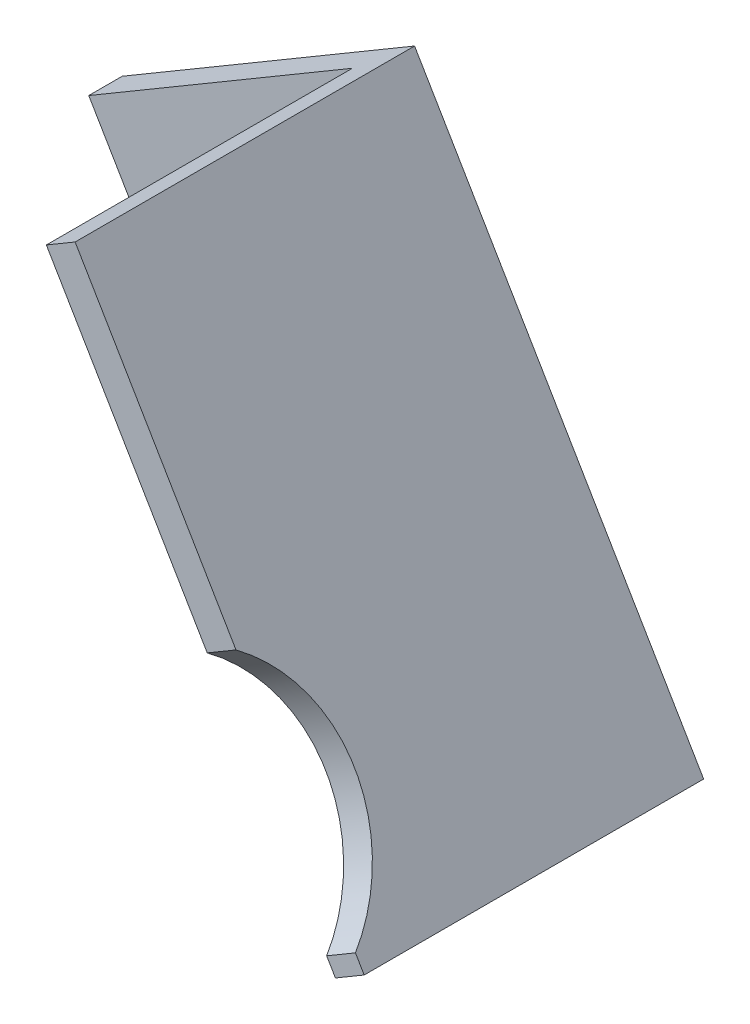
ISO-10303-21;
HEADER;
FILE_DESCRIPTION(('STEP AP214'),'2;1');
FILE_NAME('part.step','',(''),(''),'','','');
FILE_SCHEMA(('AUTOMOTIVE_DESIGN { 1 0 10303 214 1 1 1 1 }'));
ENDSEC;
DATA;
#1=APPLICATION_CONTEXT('core data for automotive mechanical design processes');
#2=APPLICATION_PROTOCOL_DEFINITION('international standard','automotive_design',2000,#1);
#3=PRODUCT_CONTEXT('',#1,'mechanical');
#4=PRODUCT('Part','Part','',(#3));
#5=PRODUCT_RELATED_PRODUCT_CATEGORY('part','',(#4));
#6=PRODUCT_DEFINITION_FORMATION('','',#4);
#7=PRODUCT_DEFINITION_CONTEXT('part definition',#1,'design');
#8=PRODUCT_DEFINITION('design','',#6,#7);
#9=PRODUCT_DEFINITION_SHAPE('','',#8);
#10=(LENGTH_UNIT() NAMED_UNIT(*) SI_UNIT(.MILLI.,.METRE.));
#11=(NAMED_UNIT(*) PLANE_ANGLE_UNIT() SI_UNIT($,.RADIAN.));
#12=(NAMED_UNIT(*) SI_UNIT($,.STERADIAN.) SOLID_ANGLE_UNIT());
#13=UNCERTAINTY_MEASURE_WITH_UNIT(LENGTH_MEASURE(1.E-05),#10,'distance_accuracy_value','');
#14=(GEOMETRIC_REPRESENTATION_CONTEXT(3) GLOBAL_UNCERTAINTY_ASSIGNED_CONTEXT((#13)) GLOBAL_UNIT_ASSIGNED_CONTEXT((#10,
#11,#12)) REPRESENTATION_CONTEXT('',''));
#15=CARTESIAN_POINT('',(0.,0.,0.));
#16=DIRECTION('',(0.,0.,1.));
#17=DIRECTION('',(1.,0.,0.));
#18=AXIS2_PLACEMENT_3D('',#15,#16,#17);
#19=CARTESIAN_POINT('',(68.1964083885509,395.912139625195,-19.2999999997127));
#20=DIRECTION('',(0.507865236102822,-0.861436533911945,0.));
#21=DIRECTION('',(3.22288283619713E-11,1.89749304438587E-11,-1.));
#22=AXIS2_PLACEMENT_3D('',#19,#20,#21);
#23=PLANE('',#22);
#24=DIRECTION('',(0.861436533911945,0.507865236102822,3.74014710514326E-11));
#25=VECTOR('',#24,1.);
#26=CARTESIAN_POINT('',(79.1366523696418,402.362028123943,-31.9999999992377));
#27=LINE('',#26,#25);
#28=CARTESIAN_POINT('',(57.2561644082784,389.462251126931,-32.0000000001877));
#29=VERTEX_POINT('',#28);
#30=CARTESIAN_POINT('',(79.1366523696419,402.362028123943,-31.9999999992377));
#31=VERTEX_POINT('',#30);
#32=EDGE_CURVE('E11',#29,#31,#27,.T.);
#33=ORIENTED_EDGE('',*,*,#32,.T.);
#34=DIRECTION('',(-3.22302396563173E-11,-1.89758010649844E-11,1.));
#35=VECTOR('',#34,1.);
#36=CARTESIAN_POINT('',(79.1366523696418,402.362028123943,-31.9999999992377));
#37=LINE('',#36,#35);
#38=CARTESIAN_POINT('',(79.1366523688232,402.362028123461,-6.59999999923769));
#39=VERTEX_POINT('',#38);
#40=EDGE_CURVE('E169',#31,#39,#37,.T.);
#41=ORIENTED_EDGE('',*,*,#40,.T.);
#42=DIRECTION('',(-0.861436533911945,-0.507865236102822,-3.74017263153092E-11));
#43=VECTOR('',#42,1.);
#44=CARTESIAN_POINT('',(79.1366523688232,402.362028123461,-6.5999999992377));
#45=LINE('',#44,#43);
#46=CARTESIAN_POINT('',(76.9830610340433,401.092365033203,-6.5999999993312));
#47=VERTEX_POINT('',#46);
#48=EDGE_CURVE('E90',#39,#47,#45,.T.);
#49=ORIENTED_EDGE('',*,*,#48,.T.);
#50=DIRECTION('',(3.22302396563173E-11,1.89758010649844E-11,-1.));
#51=VECTOR('',#50,1.);
#52=CARTESIAN_POINT('',(76.9830610340433,401.092365033203,-6.59999999933121));
#53=LINE('',#52,#51);
#54=CARTESIAN_POINT('',(76.9830610347814,401.092365033638,-29.4999999993312));
#55=VERTEX_POINT('',#54);
#56=EDGE_CURVE('E137',#47,#55,#53,.T.);
#57=ORIENTED_EDGE('',*,*,#56,.T.);
#58=DIRECTION('',(-0.861436533911945,-0.507865236102822,-3.74017825536807E-11));
#59=VECTOR('',#58,1.);
#60=CARTESIAN_POINT('',(76.9830610347813,401.092365033638,-29.4999999993312));
#61=LINE('',#60,#59);
#62=CARTESIAN_POINT('',(57.2561644081979,389.462251126884,-29.5000000001877));
#63=VERTEX_POINT('',#62);
#64=EDGE_CURVE('E145',#55,#63,#61,.T.);
#65=ORIENTED_EDGE('',*,*,#64,.T.);
#66=DIRECTION('',(3.22302396563173E-11,1.89758010649844E-11,-1.));
#67=VECTOR('',#66,1.);
#68=CARTESIAN_POINT('',(57.2561644082784,389.462251126931,-32.0000000001877));
#69=LINE('',#68,#67);
#70=EDGE_CURVE('E161',#63,#29,#69,.T.);
#71=ORIENTED_EDGE('',*,*,#70,.T.);
#72=EDGE_LOOP('',(#33,#41,#49,#57,#65,#71));
#73=FACE_BOUND('',#72,.T.);
#74=ADVANCED_FACE('F47',(#73),#23,.T.);
#75=CARTESIAN_POINT('',(46.5669358481678,432.599860167972,-19.2999999997137));
#76=DIRECTION('',(-0.507865236102822,0.861436533911945,0.));
#77=DIRECTION('',(-3.22302396563187E-11,-1.89758010649852E-11,1.));
#78=AXIS2_PLACEMENT_3D('',#75,#76,#77);
#79=PLANE('',#78);
#80=DIRECTION('',(-0.861436533911945,-0.507865236102822,-3.74014710514326E-11));
#81=VECTOR('',#80,1.);
#82=CARTESIAN_POINT('',(57.5071798292589,439.049748666719,-31.9999999992387));
#83=LINE('',#82,#81);
#84=CARTESIAN_POINT('',(57.5071798292589,439.049748666719,-31.9999999992387));
#85=VERTEX_POINT('',#84);
#86=CARTESIAN_POINT('',(35.6266918678959,426.149971669707,-32.0000000001887));
#87=VERTEX_POINT('',#86);
#88=EDGE_CURVE('E58',#85,#87,#83,.T.);
#89=ORIENTED_EDGE('',*,*,#88,.T.);
#90=DIRECTION('',(-3.22302396563173E-11,-1.89758010649844E-11,1.));
#91=VECTOR('',#90,1.);
#92=CARTESIAN_POINT('',(35.6266918678959,426.149971669707,-32.0000000001887));
#93=LINE('',#92,#91);
#94=CARTESIAN_POINT('',(35.6266918678153,426.14997166966,-29.5000000001887));
#95=VERTEX_POINT('',#94);
#96=EDGE_CURVE('E152',#87,#95,#93,.T.);
#97=ORIENTED_EDGE('',*,*,#96,.T.);
#98=DIRECTION('',(-0.861436533911945,-0.507865236102822,-3.74017825536807E-11));
#99=VECTOR('',#98,1.);
#100=CARTESIAN_POINT('',(55.3535884943984,437.780085576414,-29.4999999993321));
#101=LINE('',#100,#99);
#102=CARTESIAN_POINT('',(55.3535884943984,437.780085576414,-29.4999999993321));
#103=VERTEX_POINT('',#102);
#104=EDGE_CURVE('E143',#103,#95,#101,.T.);
#105=ORIENTED_EDGE('',*,*,#104,.F.);
#106=DIRECTION('',(3.22302396563173E-11,1.89758010649844E-11,-1.));
#107=VECTOR('',#106,1.);
#108=CARTESIAN_POINT('',(55.3535884936602,437.780085575979,-6.59999999933217));
#109=LINE('',#108,#107);
#110=CARTESIAN_POINT('',(55.3535884936602,437.780085575979,-6.59999999933217));
#111=VERTEX_POINT('',#110);
#112=EDGE_CURVE('E127',#111,#103,#109,.T.);
#113=ORIENTED_EDGE('',*,*,#112,.F.);
#114=DIRECTION('',(-0.861436533911945,-0.507865236102822,-3.74017263153092E-11));
#115=VECTOR('',#114,1.);
#116=CARTESIAN_POINT('',(57.5071798284402,439.049748666237,-6.59999999923866));
#117=LINE('',#116,#115);
#118=CARTESIAN_POINT('',(57.5071798284402,439.049748666237,-6.59999999923866));
#119=VERTEX_POINT('',#118);
#120=EDGE_CURVE('E71',#119,#111,#117,.T.);
#121=ORIENTED_EDGE('',*,*,#120,.F.);
#122=DIRECTION('',(-3.22302396563173E-11,-1.89758010649844E-11,1.));
#123=VECTOR('',#122,1.);
#124=CARTESIAN_POINT('',(57.5071798292589,439.049748666719,-31.9999999992387));
#125=LINE('',#124,#123);
#126=EDGE_CURVE('E177',#85,#119,#125,.T.);
#127=ORIENTED_EDGE('',*,*,#126,.F.);
#128=EDGE_LOOP('',(#89,#97,#105,#113,#121,#127));
#129=FACE_BOUND('',#128,.T.);
#130=ADVANCED_FACE('F150',(#129),#79,.T.);
#131=CARTESIAN_POINT('',(35.6266918678959,426.149971669707,-32.0000000001887));
#132=DIRECTION('',(3.22296540881938E-11,1.89754172558599E-11,-1.));
#133=DIRECTION('',(-0.158448683156454,-0.987367213758886,-2.3842528256955E-11));
#134=AXIS2_PLACEMENT_3D('',#131,#132,#133);
#135=PLANE('',#134);
#136=ORIENTED_EDGE('',*,*,#88,.F.);
#137=DIRECTION('',(0.507865236102822,-0.861436533911945,0.));
#138=VECTOR('',#137,1.);
#139=CARTESIAN_POINT('',(57.5071798292589,439.049748666719,-31.9999999992387));
#140=LINE('',#139,#138);
#141=EDGE_CURVE('E179',#85,#31,#140,.T.);
#142=ORIENTED_EDGE('',*,*,#141,.T.);
#143=ORIENTED_EDGE('',*,*,#32,.F.);
#144=DIRECTION('',(0.507865236102822,-0.861436533911945,0.));
#145=VECTOR('',#144,1.);
#146=CARTESIAN_POINT('',(35.6266918678959,426.149971669707,-32.0000000001887));
#147=LINE('',#146,#145);
#148=EDGE_CURVE('E184',#87,#29,#147,.T.);
#149=ORIENTED_EDGE('',*,*,#148,.F.);
#150=EDGE_LOOP('',(#136,#142,#143,#149));
#151=FACE_BOUND('',#150,.T.);
#152=ADVANCED_FACE('F49',(#151),#135,.T.);
#153=CARTESIAN_POINT('',(57.5071798284402,439.049748666237,-6.59999999923866));
#154=DIRECTION('',(-3.22298739818228E-11,-1.89755468955088E-11,1.));
#155=DIRECTION('',(0.987367213758886,-0.158448683156454,2.88169347348073E-11));
#156=AXIS2_PLACEMENT_3D('',#153,#154,#155);
#157=PLANE('',#156);
#158=DIRECTION('',(0.861436533911944,0.507865236102823,3.74007594622466E-11));
#159=VECTOR('',#158,1.);
#160=CARTESIAN_POINT('',(67.3899958967005,417.364037504661,-6.59999999933164));
#161=LINE('',#160,#159);
#162=CARTESIAN_POINT('',(67.3899958967005,417.364037504661,-6.59999999933163));
#163=VERTEX_POINT('',#162);
#164=CARTESIAN_POINT('',(69.5435872314803,418.633700594917,-6.59999999923813));
#165=VERTEX_POINT('',#164);
#166=EDGE_CURVE('E170',#163,#165,#161,.T.);
#167=ORIENTED_EDGE('',*,*,#166,.T.);
#168=DIRECTION('',(0.507865236102822,-0.861436533911945,0.));
#169=VECTOR('',#168,1.);
#170=CARTESIAN_POINT('',(57.5071798284402,439.049748666237,-6.59999999923866));
#171=LINE('',#170,#169);
#172=EDGE_CURVE('E105',#119,#165,#171,.T.);
#173=ORIENTED_EDGE('',*,*,#172,.F.);
#174=ORIENTED_EDGE('',*,*,#120,.T.);
#175=DIRECTION('',(0.507865236102822,-0.861436533911945,0.));
#176=VECTOR('',#175,1.);
#177=CARTESIAN_POINT('',(55.3535884936602,437.780085575979,-6.59999999933217));
#178=LINE('',#177,#176);
#179=EDGE_CURVE('E133',#111,#163,#178,.T.);
#180=ORIENTED_EDGE('',*,*,#179,.T.);
#181=EDGE_LOOP('',(#167,#173,#174,#180));
#182=FACE_BOUND('',#181,.T.);
#183=ADVANCED_FACE('F238',(#182),#157,.T.);
#184=CARTESIAN_POINT('',(55.3535884936602,437.780085575979,-6.59999999933217));
#185=DIRECTION('',(-0.861436533911945,-0.507865236102822,-3.7402170404519E-11));
#186=DIRECTION('',(-0.507865236102822,0.861436533911945,0.));
#187=AXIS2_PLACEMENT_3D('',#184,#185,#186);
#188=PLANE('',#187);
#189=CARTESIAN_POINT('',(71.859209974193,409.78339600611,6.67541018643562E-10));
#190=DIRECTION('',(0.861436533911945,0.507865236102822,3.74007594622466E-11));
#191=DIRECTION('',(-3.2228371513728E-11,-1.89761916095432E-11,1.));
#192=AXIS2_PLACEMENT_3D('',#189,#190,#191);
#193=CIRCLE('',#192,11.);
#194=CARTESIAN_POINT('',(76.328424052111,402.202754507809,-6.59999999933123));
#195=VERTEX_POINT('',#194);
#196=EDGE_CURVE('E174',#195,#163,#193,.T.);
#197=ORIENTED_EDGE('',*,*,#196,.T.);
#198=ORIENTED_EDGE('',*,*,#179,.F.);
#199=ORIENTED_EDGE('',*,*,#112,.T.);
#200=DIRECTION('',(0.507865236102822,-0.861436533911945,0.));
#201=VECTOR('',#200,1.);
#202=CARTESIAN_POINT('',(55.3535884943984,437.780085576414,-29.4999999993321));
#203=LINE('',#202,#201);
#204=EDGE_CURVE('E131',#103,#55,#203,.T.);
#205=ORIENTED_EDGE('',*,*,#204,.T.);
#206=ORIENTED_EDGE('',*,*,#56,.F.);
#207=DIRECTION('',(0.507865236102822,-0.861436533911945,0.));
#208=VECTOR('',#207,1.);
#209=CARTESIAN_POINT('',(55.3535884936602,437.780085575979,-6.59999999933217));
#210=LINE('',#209,#208);
#211=EDGE_CURVE('E191',#195,#47,#210,.T.);
#212=ORIENTED_EDGE('',*,*,#211,.F.);
#213=EDGE_LOOP('',(#197,#198,#199,#205,#206,#212));
#214=FACE_BOUND('',#213,.T.);
#215=ADVANCED_FACE('F130',(#214),#188,.T.);
#216=CARTESIAN_POINT('',(55.3535884943984,437.780085576414,-29.4999999993321));
#217=DIRECTION('',(-3.22299224276107E-11,-1.89755754570226E-11,1.));
#218=DIRECTION('',(0.987367213758886,-0.158448683156454,2.88169780430556E-11));
#219=AXIS2_PLACEMENT_3D('',#216,#217,#218);
#220=PLANE('',#219);
#221=ORIENTED_EDGE('',*,*,#104,.T.);
#222=DIRECTION('',(0.507865236102822,-0.861436533911945,0.));
#223=VECTOR('',#222,1.);
#224=CARTESIAN_POINT('',(35.6266918678153,426.14997166966,-29.5000000001887));
#225=LINE('',#224,#223);
#226=EDGE_CURVE('E154',#95,#63,#225,.T.);
#227=ORIENTED_EDGE('',*,*,#226,.T.);
#228=ORIENTED_EDGE('',*,*,#64,.F.);
#229=ORIENTED_EDGE('',*,*,#204,.F.);
#230=EDGE_LOOP('',(#221,#227,#228,#229));
#231=FACE_BOUND('',#230,.T.);
#232=ADVANCED_FACE('F141',(#231),#220,.T.);
#233=CARTESIAN_POINT('',(35.6266918678153,426.14997166966,-29.5000000001887));
#234=DIRECTION('',(-0.861436533911945,-0.507865236102822,-3.7402170404519E-11));
#235=DIRECTION('',(-0.507865236102822,0.861436533911945,0.));
#236=AXIS2_PLACEMENT_3D('',#233,#234,#235);
#237=PLANE('',#236);
#238=ORIENTED_EDGE('',*,*,#96,.F.);
#239=ORIENTED_EDGE('',*,*,#148,.T.);
#240=ORIENTED_EDGE('',*,*,#70,.F.);
#241=ORIENTED_EDGE('',*,*,#226,.F.);
#242=EDGE_LOOP('',(#238,#239,#240,#241));
#243=FACE_BOUND('',#242,.T.);
#244=ADVANCED_FACE('F217',(#243),#237,.T.);
#245=CARTESIAN_POINT('',(57.5071798284402,439.049748666237,-6.59999999923866));
#246=DIRECTION('',(-3.22298739818228E-11,-1.89755468955088E-11,1.));
#247=DIRECTION('',(0.987367213758886,-0.158448683156454,2.88169347348073E-11));
#248=AXIS2_PLACEMENT_3D('',#245,#246,#247);
#249=PLANE('',#248);
#250=DIRECTION('',(-0.861436533911944,-0.507865236102823,-3.74007594622466E-11));
#251=VECTOR('',#250,1.);
#252=CARTESIAN_POINT('',(76.328424052111,402.202754507809,-6.59999999933124));
#253=LINE('',#252,#251);
#254=CARTESIAN_POINT('',(78.4820153868907,403.472417598066,-6.59999999923772));
#255=VERTEX_POINT('',#254);
#256=EDGE_CURVE('E51',#255,#195,#253,.T.);
#257=ORIENTED_EDGE('',*,*,#256,.T.);
#258=ORIENTED_EDGE('',*,*,#211,.T.);
#259=ORIENTED_EDGE('',*,*,#48,.F.);
#260=DIRECTION('',(0.507865236102822,-0.861436533911945,0.));
#261=VECTOR('',#260,1.);
#262=CARTESIAN_POINT('',(57.5071798284402,439.049748666237,-6.59999999923866));
#263=LINE('',#262,#261);
#264=EDGE_CURVE('E165',#255,#39,#263,.T.);
#265=ORIENTED_EDGE('',*,*,#264,.F.);
#266=EDGE_LOOP('',(#257,#258,#259,#265));
#267=FACE_BOUND('',#266,.T.);
#268=ADVANCED_FACE('F233',(#267),#249,.T.);
#269=CARTESIAN_POINT('',(57.5071798292589,439.049748666719,-31.9999999992387));
#270=DIRECTION('',(0.861436533911945,0.507865236102822,3.7402170404519E-11));
#271=DIRECTION('',(3.22292401415211E-11,1.89774964331658E-11,-1.));
#272=AXIS2_PLACEMENT_3D('',#269,#270,#271);
#273=PLANE('',#272);
#274=CARTESIAN_POINT('',(74.0128013089727,411.053059096366,7.61042917299163E-10));
#275=DIRECTION('',(-0.861436533911945,-0.507865236102822,-3.74007594622466E-11));
#276=DIRECTION('',(-3.2228371513728E-11,-1.89761916095432E-11,1.));
#277=AXIS2_PLACEMENT_3D('',#274,#275,#276);
#278=CIRCLE('',#277,11.);
#279=EDGE_CURVE('E173',#165,#255,#278,.T.);
#280=ORIENTED_EDGE('',*,*,#279,.T.);
#281=ORIENTED_EDGE('',*,*,#264,.T.);
#282=ORIENTED_EDGE('',*,*,#40,.F.);
#283=ORIENTED_EDGE('',*,*,#141,.F.);
#284=ORIENTED_EDGE('',*,*,#126,.T.);
#285=ORIENTED_EDGE('',*,*,#172,.T.);
#286=EDGE_LOOP('',(#280,#281,#282,#283,#284,#285));
#287=FACE_BOUND('',#286,.T.);
#288=ADVANCED_FACE('F213',(#287),#273,.T.);
#289=CARTESIAN_POINT('',(71.859209974193,409.78339600611,6.67541018643562E-10));
#290=DIRECTION('',(0.861436533911944,0.507865236102823,3.74007594622466E-11));
#291=DIRECTION('',(3.22293358591672E-11,1.89745558953151E-11,-1.));
#292=AXIS2_PLACEMENT_3D('',#289,#290,#291);
#293=CYLINDRICAL_SURFACE('',#292,11.);
#294=ORIENTED_EDGE('',*,*,#196,.F.);
#295=ORIENTED_EDGE('',*,*,#256,.F.);
#296=ORIENTED_EDGE('',*,*,#279,.F.);
#297=ORIENTED_EDGE('',*,*,#166,.F.);
#298=EDGE_LOOP('',(#294,#295,#296,#297));
#299=FACE_BOUND('',#298,.T.);
#300=ADVANCED_FACE('F237',(#299),#293,.F.);
#301=CLOSED_SHELL('',(#74,#130,#152,#183,#215,#232,#244,#268,#288,#300));
#302=MANIFOLD_SOLID_BREP('B2',#301);
#303=ADVANCED_BREP_SHAPE_REPRESENTATION('',(#18,#302),#14);
#304=SHAPE_DEFINITION_REPRESENTATION(#9,#303);
ENDSEC;
END-ISO-10303-21;
